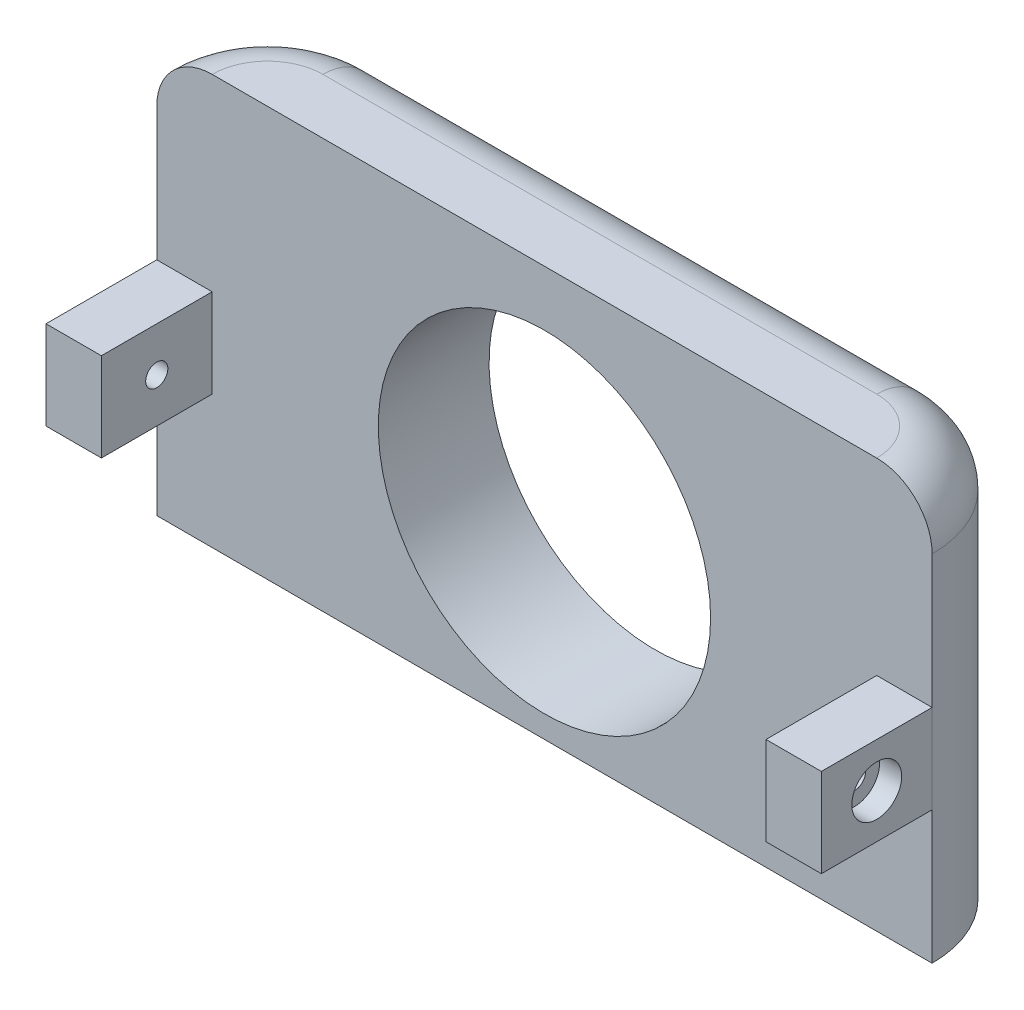
ISO-10303-21;
HEADER;
FILE_DESCRIPTION(('STEP AP214'),'2;1');
FILE_NAME('part.step','',(''),(''),'','','');
FILE_SCHEMA(('AUTOMOTIVE_DESIGN { 1 0 10303 214 1 1 1 1 }'));
ENDSEC;
DATA;
#1=APPLICATION_CONTEXT('core data for automotive mechanical design processes');
#2=APPLICATION_PROTOCOL_DEFINITION('international standard','automotive_design',2000,#1);
#3=PRODUCT_CONTEXT('',#1,'mechanical');
#4=PRODUCT('Part','Part','',(#3));
#5=PRODUCT_RELATED_PRODUCT_CATEGORY('part','',(#4));
#6=PRODUCT_DEFINITION_FORMATION('','',#4);
#7=PRODUCT_DEFINITION_CONTEXT('part definition',#1,'design');
#8=PRODUCT_DEFINITION('design','',#6,#7);
#9=PRODUCT_DEFINITION_SHAPE('','',#8);
#10=(LENGTH_UNIT() NAMED_UNIT(*) SI_UNIT(.MILLI.,.METRE.));
#11=(NAMED_UNIT(*) PLANE_ANGLE_UNIT() SI_UNIT($,.RADIAN.));
#12=(NAMED_UNIT(*) SI_UNIT($,.STERADIAN.) SOLID_ANGLE_UNIT());
#13=UNCERTAINTY_MEASURE_WITH_UNIT(LENGTH_MEASURE(1.E-05),#10,'distance_accuracy_value','');
#14=(GEOMETRIC_REPRESENTATION_CONTEXT(3) GLOBAL_UNCERTAINTY_ASSIGNED_CONTEXT((#13)) GLOBAL_UNIT_ASSIGNED_CONTEXT((#10,
#11,#12)) REPRESENTATION_CONTEXT('',''));
#15=CARTESIAN_POINT('',(0.,0.,0.));
#16=DIRECTION('',(0.,0.,1.));
#17=DIRECTION('',(1.,0.,0.));
#18=AXIS2_PLACEMENT_3D('',#15,#16,#17);
#19=CARTESIAN_POINT('',(-35.,37.,10.));
#20=DIRECTION('',(0.,0.,-1.));
#21=DIRECTION('',(-1.,0.,0.));
#22=AXIS2_PLACEMENT_3D('',#19,#20,#21);
#23=PLANE('',#22);
#24=DIRECTION('',(0.,1.,0.));
#25=VECTOR('',#24,1.);
#26=CARTESIAN_POINT('',(30.,0.,10.));
#27=LINE('',#26,#25);
#28=CARTESIAN_POINT('',(30.,12.,10.));
#29=VERTEX_POINT('',#28);
#30=CARTESIAN_POINT('',(30.,20.,10.));
#31=VERTEX_POINT('',#30);
#32=EDGE_CURVE('E173',#29,#31,#27,.T.);
#33=ORIENTED_EDGE('',*,*,#32,.T.);
#34=DIRECTION('',(1.,0.,0.));
#35=VECTOR('',#34,1.);
#36=CARTESIAN_POINT('',(30.,20.,10.));
#37=LINE('',#36,#35);
#38=CARTESIAN_POINT('',(35.,20.,10.));
#39=VERTEX_POINT('',#38);
#40=EDGE_CURVE('E169',#31,#39,#37,.T.);
#41=ORIENTED_EDGE('',*,*,#40,.T.);
#42=DIRECTION('',(0.,-1.,0.));
#43=VECTOR('',#42,1.);
#44=CARTESIAN_POINT('',(35.,37.,9.99999999999999));
#45=LINE('',#44,#43);
#46=CARTESIAN_POINT('',(35.,32.,9.99999999999999));
#47=VERTEX_POINT('',#46);
#48=EDGE_CURVE('E261',#47,#39,#45,.T.);
#49=ORIENTED_EDGE('',*,*,#48,.F.);
#50=CARTESIAN_POINT('',(30.,32.,9.99999999999999));
#51=DIRECTION('',(0.,0.,-1.));
#52=DIRECTION('',(1.,0.,0.));
#53=AXIS2_PLACEMENT_3D('',#50,#51,#52);
#54=CIRCLE('',#53,5.);
#55=CARTESIAN_POINT('',(30.,37.,9.99999999999999));
#56=VERTEX_POINT('',#55);
#57=EDGE_CURVE('E239',#56,#47,#54,.T.);
#58=ORIENTED_EDGE('',*,*,#57,.F.);
#59=DIRECTION('',(1.,0.,0.));
#60=VECTOR('',#59,1.);
#61=CARTESIAN_POINT('',(-35.,37.,10.));
#62=LINE('',#61,#60);
#63=CARTESIAN_POINT('',(-30.,37.,10.));
#64=VERTEX_POINT('',#63);
#65=EDGE_CURVE('E246',#64,#56,#62,.T.);
#66=ORIENTED_EDGE('',*,*,#65,.F.);
#67=CARTESIAN_POINT('',(-30.,32.,9.99999999999999));
#68=DIRECTION('',(0.,0.,-1.));
#69=DIRECTION('',(-1.,0.,0.));
#70=AXIS2_PLACEMENT_3D('',#67,#68,#69);
#71=CIRCLE('',#70,5.);
#72=CARTESIAN_POINT('',(-35.,32.,9.99999999999999));
#73=VERTEX_POINT('',#72);
#74=EDGE_CURVE('E243',#73,#64,#71,.T.);
#75=ORIENTED_EDGE('',*,*,#74,.F.);
#76=DIRECTION('',(0.,-1.,0.));
#77=VECTOR('',#76,1.);
#78=CARTESIAN_POINT('',(-35.,37.,10.));
#79=LINE('',#78,#77);
#80=CARTESIAN_POINT('',(-35.,20.,10.));
#81=VERTEX_POINT('',#80);
#82=EDGE_CURVE('E265',#73,#81,#79,.T.);
#83=ORIENTED_EDGE('',*,*,#82,.T.);
#84=DIRECTION('',(-1.,0.,0.));
#85=VECTOR('',#84,1.);
#86=CARTESIAN_POINT('',(-30.,20.,10.));
#87=LINE('',#86,#85);
#88=CARTESIAN_POINT('',(-30.,20.,10.));
#89=VERTEX_POINT('',#88);
#90=EDGE_CURVE('E225',#89,#81,#87,.T.);
#91=ORIENTED_EDGE('',*,*,#90,.F.);
#92=DIRECTION('',(0.,1.,0.));
#93=VECTOR('',#92,1.);
#94=CARTESIAN_POINT('',(-30.,0.,10.));
#95=LINE('',#94,#93);
#96=CARTESIAN_POINT('',(-30.,12.,10.));
#97=VERTEX_POINT('',#96);
#98=EDGE_CURVE('E210',#97,#89,#95,.T.);
#99=ORIENTED_EDGE('',*,*,#98,.F.);
#100=DIRECTION('',(-1.,0.,0.));
#101=VECTOR('',#100,1.);
#102=CARTESIAN_POINT('',(-30.,12.,10.));
#103=LINE('',#102,#101);
#104=CARTESIAN_POINT('',(-35.,12.,10.));
#105=VERTEX_POINT('',#104);
#106=EDGE_CURVE('E228',#97,#105,#103,.T.);
#107=ORIENTED_EDGE('',*,*,#106,.T.);
#108=CARTESIAN_POINT('',(-35.,0.,10.));
#109=VERTEX_POINT('',#108);
#110=EDGE_CURVE('E264',#105,#109,#79,.T.);
#111=ORIENTED_EDGE('',*,*,#110,.T.);
#112=DIRECTION('',(1.,0.,0.));
#113=VECTOR('',#112,1.);
#114=CARTESIAN_POINT('',(-35.,0.,10.));
#115=LINE('',#114,#113);
#116=CARTESIAN_POINT('',(35.,0.,9.99999999999999));
#117=VERTEX_POINT('',#116);
#118=EDGE_CURVE('E250',#109,#117,#115,.T.);
#119=ORIENTED_EDGE('',*,*,#118,.T.);
#120=CARTESIAN_POINT('',(35.,12.,9.99999999999999));
#121=VERTEX_POINT('',#120);
#122=EDGE_CURVE('E249',#121,#117,#45,.T.);
#123=ORIENTED_EDGE('',*,*,#122,.F.);
#124=DIRECTION('',(1.,0.,0.));
#125=VECTOR('',#124,1.);
#126=CARTESIAN_POINT('',(30.,12.,10.));
#127=LINE('',#126,#125);
#128=EDGE_CURVE('E188',#29,#121,#127,.T.);
#129=ORIENTED_EDGE('',*,*,#128,.F.);
#130=EDGE_LOOP('',(#33,#41,#49,#58,#66,#75,#83,#91,#99,#107,#111,#119,#123,#129));
#131=FACE_BOUND('',#130,.T.);
#132=CARTESIAN_POINT('',(0.,17.,9.99999999999999));
#133=DIRECTION('',(0.,0.,1.));
#134=DIRECTION('',(1.,0.,0.));
#135=AXIS2_PLACEMENT_3D('',#132,#133,#134);
#136=CIRCLE('',#135,15.);
#137=CARTESIAN_POINT('',(15.,17.,9.99999999999999));
#138=VERTEX_POINT('',#137);
#139=EDGE_CURVE('E233',#138,#138,#136,.T.);
#140=ORIENTED_EDGE('',*,*,#139,.F.);
#141=EDGE_LOOP('',(#140));
#142=FACE_BOUND('',#141,.T.);
#143=ADVANCED_FACE('F42',(#131,#142),#23,.F.);
#144=CARTESIAN_POINT('',(25.,37.,9.99999999999999));
#145=DIRECTION('',(0.,1.,0.));
#146=DIRECTION('',(0.,0.,1.));
#147=AXIS2_PLACEMENT_3D('',#144,#145,#146);
#148=PLANE('',#147);
#149=ORIENTED_EDGE('',*,*,#65,.T.);
#150=CARTESIAN_POINT('',(25.,37.,9.99999999999999));
#151=DIRECTION('',(0.,1.,0.));
#152=DIRECTION('',(0.,0.,1.));
#153=AXIS2_PLACEMENT_3D('',#150,#151,#152);
#154=CIRCLE('',#153,5.);
#155=CARTESIAN_POINT('',(25.,37.,4.99999999999999));
#156=VERTEX_POINT('',#155);
#157=EDGE_CURVE('E276',#56,#156,#154,.T.);
#158=ORIENTED_EDGE('',*,*,#157,.T.);
#159=DIRECTION('',(-1.,0.,0.));
#160=VECTOR('',#159,1.);
#161=CARTESIAN_POINT('',(-25.,37.,5.));
#162=LINE('',#161,#160);
#163=CARTESIAN_POINT('',(-25.,37.,5.));
#164=VERTEX_POINT('',#163);
#165=EDGE_CURVE('E272',#156,#164,#162,.T.);
#166=ORIENTED_EDGE('',*,*,#165,.T.);
#167=CARTESIAN_POINT('',(-25.,37.,10.));
#168=DIRECTION('',(0.,1.,0.));
#169=DIRECTION('',(0.,0.,1.));
#170=AXIS2_PLACEMENT_3D('',#167,#168,#169);
#171=CIRCLE('',#170,5.);
#172=EDGE_CURVE('E274',#164,#64,#171,.T.);
#173=ORIENTED_EDGE('',*,*,#172,.T.);
#174=EDGE_LOOP('',(#149,#158,#166,#173));
#175=FACE_BOUND('',#174,.T.);
#176=ADVANCED_FACE('F297',(#175),#148,.T.);
#177=CARTESIAN_POINT('',(25.,37.,9.99999999999999));
#178=DIRECTION('',(0.,-1.,0.));
#179=DIRECTION('',(0.,0.,-1.));
#180=AXIS2_PLACEMENT_3D('',#177,#178,#179);
#181=CYLINDRICAL_SURFACE('',#180,10.);
#182=DIRECTION('',(0.,-1.,0.));
#183=VECTOR('',#182,1.);
#184=CARTESIAN_POINT('',(25.,37.,0.));
#185=LINE('',#184,#183);
#186=CARTESIAN_POINT('',(25.,32.,0.));
#187=VERTEX_POINT('',#186);
#188=CARTESIAN_POINT('',(25.,0.,0.));
#189=VERTEX_POINT('',#188);
#190=EDGE_CURVE('E270',#187,#189,#185,.T.);
#191=ORIENTED_EDGE('',*,*,#190,.F.);
#192=CARTESIAN_POINT('',(25.,32.,9.99999999999999));
#193=DIRECTION('',(0.,1.,0.));
#194=DIRECTION('',(0.,0.,1.));
#195=AXIS2_PLACEMENT_3D('',#192,#193,#194);
#196=CIRCLE('',#195,10.);
#197=EDGE_CURVE('E278',#187,#47,#196,.F.);
#198=ORIENTED_EDGE('',*,*,#197,.T.);
#199=ORIENTED_EDGE('',*,*,#48,.T.);
#200=DIRECTION('',(0.,1.,0.));
#201=VECTOR('',#200,1.);
#202=CARTESIAN_POINT('',(35.,0.,10.));
#203=LINE('',#202,#201);
#204=EDGE_CURVE('E184',#121,#39,#203,.T.);
#205=ORIENTED_EDGE('',*,*,#204,.F.);
#206=ORIENTED_EDGE('',*,*,#122,.T.);
#207=CARTESIAN_POINT('',(25.,0.,9.99999999999999));
#208=DIRECTION('',(0.,1.,0.));
#209=DIRECTION('',(0.,0.,1.));
#210=AXIS2_PLACEMENT_3D('',#207,#208,#209);
#211=CIRCLE('',#210,10.);
#212=EDGE_CURVE('E242',#117,#189,#211,.T.);
#213=ORIENTED_EDGE('',*,*,#212,.T.);
#214=EDGE_LOOP('',(#191,#198,#199,#205,#206,#213));
#215=FACE_BOUND('',#214,.T.);
#216=ADVANCED_FACE('F306',(#215),#181,.T.);
#217=CARTESIAN_POINT('',(-25.,37.,0.));
#218=DIRECTION('',(0.,0.,1.));
#219=DIRECTION('',(1.,0.,0.));
#220=AXIS2_PLACEMENT_3D('',#217,#218,#219);
#221=PLANE('',#220);
#222=DIRECTION('',(-1.,0.,0.));
#223=VECTOR('',#222,1.);
#224=CARTESIAN_POINT('',(25.,32.,0.));
#225=LINE('',#224,#223);
#226=CARTESIAN_POINT('',(-25.,32.,0.));
#227=VERTEX_POINT('',#226);
#228=CARTESIAN_POINT('',(0.,32.,0.));
#229=VERTEX_POINT('',#228);
#230=EDGE_CURVE('E11',#227,#229,#225,.F.);
#231=ORIENTED_EDGE('',*,*,#230,.T.);
#232=CARTESIAN_POINT('',(0.,17.,0.));
#233=DIRECTION('',(0.,0.,1.));
#234=DIRECTION('',(1.,0.,0.));
#235=AXIS2_PLACEMENT_3D('',#232,#233,#234);
#236=CIRCLE('',#235,15.);
#237=EDGE_CURVE('E236',#229,#229,#236,.F.);
#238=ORIENTED_EDGE('',*,*,#237,.F.);
#239=EDGE_CURVE('E51',#229,#187,#225,.F.);
#240=ORIENTED_EDGE('',*,*,#239,.T.);
#241=ORIENTED_EDGE('',*,*,#190,.T.);
#242=DIRECTION('',(-1.,0.,0.));
#243=VECTOR('',#242,1.);
#244=CARTESIAN_POINT('',(-25.,0.,0.));
#245=LINE('',#244,#243);
#246=CARTESIAN_POINT('',(-25.,0.,0.));
#247=VERTEX_POINT('',#246);
#248=EDGE_CURVE('E253',#189,#247,#245,.T.);
#249=ORIENTED_EDGE('',*,*,#248,.T.);
#250=DIRECTION('',(0.,-1.,0.));
#251=VECTOR('',#250,1.);
#252=CARTESIAN_POINT('',(-25.,37.,0.));
#253=LINE('',#252,#251);
#254=EDGE_CURVE('E268',#227,#247,#253,.T.);
#255=ORIENTED_EDGE('',*,*,#254,.F.);
#256=EDGE_LOOP('',(#231,#238,#240,#241,#249,#255));
#257=FACE_BOUND('',#256,.T.);
#258=ADVANCED_FACE('F313',(#257),#221,.F.);
#259=CARTESIAN_POINT('',(-25.,37.,10.));
#260=DIRECTION('',(0.,-1.,0.));
#261=DIRECTION('',(0.,0.,-1.));
#262=AXIS2_PLACEMENT_3D('',#259,#260,#261);
#263=CYLINDRICAL_SURFACE('',#262,10.);
#264=ORIENTED_EDGE('',*,*,#82,.F.);
#265=CARTESIAN_POINT('',(-25.,32.,10.));
#266=DIRECTION('',(0.,1.,0.));
#267=DIRECTION('',(0.,0.,1.));
#268=AXIS2_PLACEMENT_3D('',#265,#266,#267);
#269=CIRCLE('',#268,10.);
#270=EDGE_CURVE('E280',#73,#227,#269,.F.);
#271=ORIENTED_EDGE('',*,*,#270,.T.);
#272=ORIENTED_EDGE('',*,*,#254,.T.);
#273=CARTESIAN_POINT('',(-25.,0.,10.));
#274=DIRECTION('',(0.,1.,0.));
#275=DIRECTION('',(0.,0.,-1.));
#276=AXIS2_PLACEMENT_3D('',#273,#274,#275);
#277=CIRCLE('',#276,10.);
#278=EDGE_CURVE('E256',#247,#109,#277,.T.);
#279=ORIENTED_EDGE('',*,*,#278,.T.);
#280=ORIENTED_EDGE('',*,*,#110,.F.);
#281=DIRECTION('',(0.,1.,0.));
#282=VECTOR('',#281,1.);
#283=CARTESIAN_POINT('',(-35.,0.,10.));
#284=LINE('',#283,#282);
#285=EDGE_CURVE('E219',#105,#81,#284,.T.);
#286=ORIENTED_EDGE('',*,*,#285,.T.);
#287=EDGE_LOOP('',(#264,#271,#272,#279,#280,#286));
#288=FACE_BOUND('',#287,.T.);
#289=ADVANCED_FACE('F316',(#288),#263,.T.);
#290=CARTESIAN_POINT('',(25.,0.,9.99999999999999));
#291=DIRECTION('',(0.,1.,0.));
#292=DIRECTION('',(0.,0.,1.));
#293=AXIS2_PLACEMENT_3D('',#290,#291,#292);
#294=PLANE('',#293);
#295=ORIENTED_EDGE('',*,*,#212,.F.);
#296=ORIENTED_EDGE('',*,*,#118,.F.);
#297=ORIENTED_EDGE('',*,*,#278,.F.);
#298=ORIENTED_EDGE('',*,*,#248,.F.);
#299=EDGE_LOOP('',(#295,#296,#297,#298));
#300=FACE_BOUND('',#299,.T.);
#301=ADVANCED_FACE('F333',(#300),#294,.F.);
#302=CARTESIAN_POINT('',(-25.,32.,10.));
#303=DIRECTION('',(0.,1.,0.));
#304=DIRECTION('',(0.,0.,1.));
#305=AXIS2_PLACEMENT_3D('',#302,#303,#304);
#306=TOROIDAL_SURFACE('',#305,5.,5.);
#307=ORIENTED_EDGE('',*,*,#74,.T.);
#308=ORIENTED_EDGE('',*,*,#172,.F.);
#309=CARTESIAN_POINT('',(-25.,32.,5.));
#310=DIRECTION('',(1.,0.,0.));
#311=DIRECTION('',(0.,0.,-1.));
#312=AXIS2_PLACEMENT_3D('',#309,#310,#311);
#313=CIRCLE('',#312,5.);
#314=EDGE_CURVE('E46',#227,#164,#313,.T.);
#315=ORIENTED_EDGE('',*,*,#314,.F.);
#316=ORIENTED_EDGE('',*,*,#270,.F.);
#317=EDGE_LOOP('',(#307,#308,#315,#316));
#318=FACE_BOUND('',#317,.T.);
#319=ADVANCED_FACE('F44',(#318),#306,.T.);
#320=CARTESIAN_POINT('',(25.,32.,4.99999999999999));
#321=DIRECTION('',(1.,0.,0.));
#322=DIRECTION('',(0.,0.,-1.));
#323=AXIS2_PLACEMENT_3D('',#320,#321,#322);
#324=CYLINDRICAL_SURFACE('',#323,5.);
#325=ORIENTED_EDGE('',*,*,#314,.T.);
#326=ORIENTED_EDGE('',*,*,#165,.F.);
#327=CARTESIAN_POINT('',(25.,32.,4.99999999999999));
#328=DIRECTION('',(1.,0.,0.));
#329=DIRECTION('',(0.,1.,0.));
#330=AXIS2_PLACEMENT_3D('',#327,#328,#329);
#331=CIRCLE('',#330,5.);
#332=EDGE_CURVE('E238',#187,#156,#331,.T.);
#333=ORIENTED_EDGE('',*,*,#332,.F.);
#334=ORIENTED_EDGE('',*,*,#239,.F.);
#335=ORIENTED_EDGE('',*,*,#230,.F.);
#336=EDGE_LOOP('',(#325,#326,#333,#334,#335));
#337=FACE_BOUND('',#336,.T.);
#338=ADVANCED_FACE('F290',(#337),#324,.T.);
#339=CARTESIAN_POINT('',(25.,32.,9.99999999999999));
#340=DIRECTION('',(0.,1.,0.));
#341=DIRECTION('',(0.,0.,1.));
#342=AXIS2_PLACEMENT_3D('',#339,#340,#341);
#343=DEGENERATE_TOROIDAL_SURFACE('',#342,5.,5.,.T.);
#344=ORIENTED_EDGE('',*,*,#332,.T.);
#345=ORIENTED_EDGE('',*,*,#157,.F.);
#346=ORIENTED_EDGE('',*,*,#57,.T.);
#347=ORIENTED_EDGE('',*,*,#197,.F.);
#348=EDGE_LOOP('',(#344,#345,#346,#347));
#349=FACE_BOUND('',#348,.T.);
#350=ADVANCED_FACE('F303',(#349),#343,.T.);
#351=CARTESIAN_POINT('',(0.,17.,-0.00100000000000794));
#352=DIRECTION('',(0.,0.,1.));
#353=DIRECTION('',(1.,0.,0.));
#354=AXIS2_PLACEMENT_3D('',#351,#352,#353);
#355=CYLINDRICAL_SURFACE('',#354,15.);
#356=ORIENTED_EDGE('',*,*,#139,.T.);
#357=EDGE_LOOP('',(#356));
#358=FACE_BOUND('',#357,.T.);
#359=ORIENTED_EDGE('',*,*,#237,.T.);
#360=EDGE_LOOP('',(#359));
#361=FACE_BOUND('',#360,.T.);
#362=ADVANCED_FACE('F353',(#358,#361),#355,.F.);
#363=CARTESIAN_POINT('',(-30.,0.,20.));
#364=DIRECTION('',(0.,0.,1.));
#365=DIRECTION('',(1.,0.,0.));
#366=AXIS2_PLACEMENT_3D('',#363,#364,#365);
#367=PLANE('',#366);
#368=DIRECTION('',(0.,1.,0.));
#369=VECTOR('',#368,1.);
#370=CARTESIAN_POINT('',(-35.,0.,20.));
#371=LINE('',#370,#369);
#372=CARTESIAN_POINT('',(-35.,12.,20.));
#373=VERTEX_POINT('',#372);
#374=CARTESIAN_POINT('',(-35.,20.,20.));
#375=VERTEX_POINT('',#374);
#376=EDGE_CURVE('E197',#373,#375,#371,.T.);
#377=ORIENTED_EDGE('',*,*,#376,.F.);
#378=DIRECTION('',(-1.,0.,0.));
#379=VECTOR('',#378,1.);
#380=CARTESIAN_POINT('',(-30.,12.,20.));
#381=LINE('',#380,#379);
#382=CARTESIAN_POINT('',(-30.,12.,20.));
#383=VERTEX_POINT('',#382);
#384=EDGE_CURVE('E231',#383,#373,#381,.T.);
#385=ORIENTED_EDGE('',*,*,#384,.F.);
#386=DIRECTION('',(0.,1.,0.));
#387=VECTOR('',#386,1.);
#388=CARTESIAN_POINT('',(-30.,0.,20.));
#389=LINE('',#388,#387);
#390=CARTESIAN_POINT('',(-30.,20.,20.));
#391=VERTEX_POINT('',#390);
#392=EDGE_CURVE('E203',#383,#391,#389,.T.);
#393=ORIENTED_EDGE('',*,*,#392,.T.);
#394=DIRECTION('',(-1.,0.,0.));
#395=VECTOR('',#394,1.);
#396=CARTESIAN_POINT('',(-30.,20.,20.));
#397=LINE('',#396,#395);
#398=EDGE_CURVE('E215',#391,#375,#397,.T.);
#399=ORIENTED_EDGE('',*,*,#398,.T.);
#400=EDGE_LOOP('',(#377,#385,#393,#399));
#401=FACE_BOUND('',#400,.T.);
#402=ADVANCED_FACE('F370',(#401),#367,.T.);
#403=CARTESIAN_POINT('',(-30.,12.,0.));
#404=DIRECTION('',(0.,-1.,0.));
#405=DIRECTION('',(0.,0.,-1.));
#406=AXIS2_PLACEMENT_3D('',#403,#404,#405);
#407=PLANE('',#406);
#408=DIRECTION('',(0.,0.,1.));
#409=VECTOR('',#408,1.);
#410=CARTESIAN_POINT('',(-35.,12.,0.));
#411=LINE('',#410,#409);
#412=EDGE_CURVE('E67',#105,#373,#411,.T.);
#413=ORIENTED_EDGE('',*,*,#412,.F.);
#414=ORIENTED_EDGE('',*,*,#106,.F.);
#415=DIRECTION('',(0.,0.,1.));
#416=VECTOR('',#415,1.);
#417=CARTESIAN_POINT('',(-30.,12.,0.));
#418=LINE('',#417,#416);
#419=EDGE_CURVE('E207',#97,#383,#418,.T.);
#420=ORIENTED_EDGE('',*,*,#419,.T.);
#421=ORIENTED_EDGE('',*,*,#384,.T.);
#422=EDGE_LOOP('',(#413,#414,#420,#421));
#423=FACE_BOUND('',#422,.T.);
#424=ADVANCED_FACE('F328',(#423),#407,.T.);
#425=CARTESIAN_POINT('',(-30.,16.,15.));
#426=DIRECTION('',(-1.,0.,0.));
#427=DIRECTION('',(0.,0.,1.));
#428=AXIS2_PLACEMENT_3D('',#425,#426,#427);
#429=CYLINDRICAL_SURFACE('',#428,1.);
#430=CARTESIAN_POINT('',(-33.,16.,15.));
#431=DIRECTION('',(1.,0.,0.));
#432=DIRECTION('',(0.,0.,-1.));
#433=AXIS2_PLACEMENT_3D('',#430,#431,#432);
#434=CIRCLE('',#433,1.);
#435=CARTESIAN_POINT('',(-33.,16.,14.));
#436=VERTEX_POINT('',#435);
#437=EDGE_CURVE('E191',#436,#436,#434,.T.);
#438=ORIENTED_EDGE('',*,*,#437,.F.);
#439=EDGE_LOOP('',(#438));
#440=FACE_BOUND('',#439,.T.);
#441=CARTESIAN_POINT('',(-30.,16.,15.));
#442=DIRECTION('',(1.,0.,0.));
#443=DIRECTION('',(0.,0.,-1.));
#444=AXIS2_PLACEMENT_3D('',#441,#442,#443);
#445=CIRCLE('',#444,1.);
#446=CARTESIAN_POINT('',(-30.,16.,14.));
#447=VERTEX_POINT('',#446);
#448=EDGE_CURVE('E200',#447,#447,#445,.T.);
#449=ORIENTED_EDGE('',*,*,#448,.T.);
#450=EDGE_LOOP('',(#449));
#451=FACE_BOUND('',#450,.T.);
#452=ADVANCED_FACE('F386',(#440,#451),#429,.F.);
#453=CARTESIAN_POINT('',(-30.,20.,0.));
#454=DIRECTION('',(0.,-1.,0.));
#455=DIRECTION('',(0.,0.,-1.));
#456=AXIS2_PLACEMENT_3D('',#453,#454,#455);
#457=PLANE('',#456);
#458=DIRECTION('',(0.,0.,1.));
#459=VECTOR('',#458,1.);
#460=CARTESIAN_POINT('',(-35.,20.,0.));
#461=LINE('',#460,#459);
#462=EDGE_CURVE('E204',#81,#375,#461,.T.);
#463=ORIENTED_EDGE('',*,*,#462,.T.);
#464=ORIENTED_EDGE('',*,*,#398,.F.);
#465=DIRECTION('',(0.,0.,1.));
#466=VECTOR('',#465,1.);
#467=CARTESIAN_POINT('',(-30.,20.,0.));
#468=LINE('',#467,#466);
#469=EDGE_CURVE('E213',#89,#391,#468,.T.);
#470=ORIENTED_EDGE('',*,*,#469,.F.);
#471=ORIENTED_EDGE('',*,*,#90,.T.);
#472=EDGE_LOOP('',(#463,#464,#470,#471));
#473=FACE_BOUND('',#472,.T.);
#474=ADVANCED_FACE('F322',(#473),#457,.F.);
#475=CARTESIAN_POINT('',(-30.,0.,0.));
#476=DIRECTION('',(1.,0.,0.));
#477=DIRECTION('',(0.,0.,-1.));
#478=AXIS2_PLACEMENT_3D('',#475,#476,#477);
#479=PLANE('',#478);
#480=ORIENTED_EDGE('',*,*,#448,.F.);
#481=EDGE_LOOP('',(#480));
#482=FACE_BOUND('',#481,.T.);
#483=ORIENTED_EDGE('',*,*,#392,.F.);
#484=ORIENTED_EDGE('',*,*,#419,.F.);
#485=ORIENTED_EDGE('',*,*,#98,.T.);
#486=ORIENTED_EDGE('',*,*,#469,.T.);
#487=EDGE_LOOP('',(#483,#484,#485,#486));
#488=FACE_BOUND('',#487,.T.);
#489=ADVANCED_FACE('F327',(#482,#488),#479,.T.);
#490=CARTESIAN_POINT('',(-35.,0.,0.));
#491=DIRECTION('',(1.,0.,0.));
#492=DIRECTION('',(0.,0.,-1.));
#493=AXIS2_PLACEMENT_3D('',#490,#491,#492);
#494=PLANE('',#493);
#495=CARTESIAN_POINT('',(-35.,16.,15.));
#496=DIRECTION('',(1.,0.,0.));
#497=DIRECTION('',(0.,0.,-1.));
#498=AXIS2_PLACEMENT_3D('',#495,#496,#497);
#499=CIRCLE('',#498,2.25);
#500=CARTESIAN_POINT('',(-35.,16.,12.75));
#501=VERTEX_POINT('',#500);
#502=EDGE_CURVE('E168',#501,#501,#499,.T.);
#503=ORIENTED_EDGE('',*,*,#502,.T.);
#504=EDGE_LOOP('',(#503));
#505=FACE_BOUND('',#504,.T.);
#506=ORIENTED_EDGE('',*,*,#376,.T.);
#507=ORIENTED_EDGE('',*,*,#462,.F.);
#508=ORIENTED_EDGE('',*,*,#285,.F.);
#509=ORIENTED_EDGE('',*,*,#412,.T.);
#510=EDGE_LOOP('',(#506,#507,#508,#509));
#511=FACE_BOUND('',#510,.T.);
#512=ADVANCED_FACE('F407',(#505,#511),#494,.F.);
#513=CARTESIAN_POINT('',(-33.,16.,15.));
#514=DIRECTION('',(-1.,0.,0.));
#515=DIRECTION('',(0.,0.,1.));
#516=AXIS2_PLACEMENT_3D('',#513,#514,#515);
#517=CYLINDRICAL_SURFACE('',#516,2.25);
#518=CARTESIAN_POINT('',(-33.,16.,15.));
#519=DIRECTION('',(1.,0.,0.));
#520=DIRECTION('',(0.,0.,-1.));
#521=AXIS2_PLACEMENT_3D('',#518,#519,#520);
#522=CIRCLE('',#521,2.25);
#523=CARTESIAN_POINT('',(-33.,16.,12.75));
#524=VERTEX_POINT('',#523);
#525=EDGE_CURVE('E194',#524,#524,#522,.T.);
#526=ORIENTED_EDGE('',*,*,#525,.T.);
#527=EDGE_LOOP('',(#526));
#528=FACE_BOUND('',#527,.T.);
#529=ORIENTED_EDGE('',*,*,#502,.F.);
#530=EDGE_LOOP('',(#529));
#531=FACE_BOUND('',#530,.T.);
#532=ADVANCED_FACE('F414',(#528,#531),#517,.F.);
#533=CARTESIAN_POINT('',(-33.,0.,0.));
#534=DIRECTION('',(1.,0.,0.));
#535=DIRECTION('',(0.,0.,-1.));
#536=AXIS2_PLACEMENT_3D('',#533,#534,#535);
#537=PLANE('',#536);
#538=ORIENTED_EDGE('',*,*,#437,.T.);
#539=EDGE_LOOP('',(#538));
#540=FACE_BOUND('',#539,.T.);
#541=ORIENTED_EDGE('',*,*,#525,.F.);
#542=EDGE_LOOP('',(#541));
#543=FACE_BOUND('',#542,.T.);
#544=ADVANCED_FACE('F422',(#540,#543),#537,.F.);
#545=CARTESIAN_POINT('',(30.,0.,20.));
#546=DIRECTION('',(0.,0.,-1.));
#547=DIRECTION('',(-1.,0.,0.));
#548=AXIS2_PLACEMENT_3D('',#545,#546,#547);
#549=PLANE('',#548);
#550=DIRECTION('',(0.,1.,0.));
#551=VECTOR('',#550,1.);
#552=CARTESIAN_POINT('',(35.,0.,20.));
#553=LINE('',#552,#551);
#554=CARTESIAN_POINT('',(35.,12.,20.));
#555=VERTEX_POINT('',#554);
#556=CARTESIAN_POINT('',(35.,20.,20.));
#557=VERTEX_POINT('',#556);
#558=EDGE_CURVE('E165',#555,#557,#553,.T.);
#559=ORIENTED_EDGE('',*,*,#558,.T.);
#560=DIRECTION('',(1.,0.,0.));
#561=VECTOR('',#560,1.);
#562=CARTESIAN_POINT('',(30.,20.,20.));
#563=LINE('',#562,#561);
#564=CARTESIAN_POINT('',(30.,20.,20.));
#565=VERTEX_POINT('',#564);
#566=EDGE_CURVE('E163',#565,#557,#563,.T.);
#567=ORIENTED_EDGE('',*,*,#566,.F.);
#568=DIRECTION('',(0.,1.,0.));
#569=VECTOR('',#568,1.);
#570=CARTESIAN_POINT('',(30.,0.,20.));
#571=LINE('',#570,#569);
#572=CARTESIAN_POINT('',(30.,12.,20.));
#573=VERTEX_POINT('',#572);
#574=EDGE_CURVE('E149',#573,#565,#571,.T.);
#575=ORIENTED_EDGE('',*,*,#574,.F.);
#576=DIRECTION('',(1.,0.,0.));
#577=VECTOR('',#576,1.);
#578=CARTESIAN_POINT('',(30.,12.,20.));
#579=LINE('',#578,#577);
#580=EDGE_CURVE('E179',#573,#555,#579,.T.);
#581=ORIENTED_EDGE('',*,*,#580,.T.);
#582=EDGE_LOOP('',(#559,#567,#575,#581));
#583=FACE_BOUND('',#582,.T.);
#584=ADVANCED_FACE('F164',(#583),#549,.F.);
#585=CARTESIAN_POINT('',(30.,20.,0.));
#586=DIRECTION('',(0.,1.,0.));
#587=DIRECTION('',(0.,0.,1.));
#588=AXIS2_PLACEMENT_3D('',#585,#586,#587);
#589=PLANE('',#588);
#590=DIRECTION('',(0.,0.,1.));
#591=VECTOR('',#590,1.);
#592=CARTESIAN_POINT('',(35.,20.,0.));
#593=LINE('',#592,#591);
#594=EDGE_CURVE('E181',#39,#557,#593,.T.);
#595=ORIENTED_EDGE('',*,*,#594,.F.);
#596=ORIENTED_EDGE('',*,*,#40,.F.);
#597=DIRECTION('',(0.,0.,1.));
#598=VECTOR('',#597,1.);
#599=CARTESIAN_POINT('',(30.,20.,0.));
#600=LINE('',#599,#598);
#601=EDGE_CURVE('E154',#31,#565,#600,.T.);
#602=ORIENTED_EDGE('',*,*,#601,.T.);
#603=ORIENTED_EDGE('',*,*,#566,.T.);
#604=EDGE_LOOP('',(#595,#596,#602,#603));
#605=FACE_BOUND('',#604,.T.);
#606=ADVANCED_FACE('F171',(#605),#589,.T.);
#607=CARTESIAN_POINT('',(30.,16.,15.));
#608=DIRECTION('',(1.,0.,0.));
#609=DIRECTION('',(0.,0.,-1.));
#610=AXIS2_PLACEMENT_3D('',#607,#608,#609);
#611=CYLINDRICAL_SURFACE('',#610,1.);
#612=CARTESIAN_POINT('',(33.,16.,15.));
#613=DIRECTION('',(1.,0.,0.));
#614=DIRECTION('',(0.,0.,-1.));
#615=AXIS2_PLACEMENT_3D('',#612,#613,#614);
#616=CIRCLE('',#615,1.);
#617=CARTESIAN_POINT('',(33.,16.,14.));
#618=VERTEX_POINT('',#617);
#619=EDGE_CURVE('E631',#618,#618,#616,.T.);
#620=ORIENTED_EDGE('',*,*,#619,.T.);
#621=EDGE_LOOP('',(#620));
#622=FACE_BOUND('',#621,.T.);
#623=CARTESIAN_POINT('',(30.,16.,15.));
#624=DIRECTION('',(1.,0.,0.));
#625=DIRECTION('',(0.,0.,-1.));
#626=AXIS2_PLACEMENT_3D('',#623,#624,#625);
#627=CIRCLE('',#626,1.);
#628=CARTESIAN_POINT('',(30.,16.,14.));
#629=VERTEX_POINT('',#628);
#630=EDGE_CURVE('E160',#629,#629,#627,.T.);
#631=ORIENTED_EDGE('',*,*,#630,.F.);
#632=EDGE_LOOP('',(#631));
#633=FACE_BOUND('',#632,.T.);
#634=ADVANCED_FACE('F444',(#622,#633),#611,.F.);
#635=CARTESIAN_POINT('',(30.,12.,0.));
#636=DIRECTION('',(0.,1.,0.));
#637=DIRECTION('',(0.,0.,1.));
#638=AXIS2_PLACEMENT_3D('',#635,#636,#637);
#639=PLANE('',#638);
#640=DIRECTION('',(0.,0.,1.));
#641=VECTOR('',#640,1.);
#642=CARTESIAN_POINT('',(35.,12.,0.));
#643=LINE('',#642,#641);
#644=EDGE_CURVE('E59',#121,#555,#643,.T.);
#645=ORIENTED_EDGE('',*,*,#644,.T.);
#646=ORIENTED_EDGE('',*,*,#580,.F.);
#647=DIRECTION('',(0.,0.,1.));
#648=VECTOR('',#647,1.);
#649=CARTESIAN_POINT('',(30.,12.,0.));
#650=LINE('',#649,#648);
#651=EDGE_CURVE('E156',#29,#573,#650,.T.);
#652=ORIENTED_EDGE('',*,*,#651,.F.);
#653=ORIENTED_EDGE('',*,*,#128,.T.);
#654=EDGE_LOOP('',(#645,#646,#652,#653));
#655=FACE_BOUND('',#654,.T.);
#656=ADVANCED_FACE('F451',(#655),#639,.F.);
#657=CARTESIAN_POINT('',(30.,0.,0.));
#658=DIRECTION('',(-1.,0.,0.));
#659=DIRECTION('',(0.,0.,-1.));
#660=AXIS2_PLACEMENT_3D('',#657,#658,#659);
#661=PLANE('',#660);
#662=ORIENTED_EDGE('',*,*,#630,.T.);
#663=EDGE_LOOP('',(#662));
#664=FACE_BOUND('',#663,.T.);
#665=ORIENTED_EDGE('',*,*,#574,.T.);
#666=ORIENTED_EDGE('',*,*,#601,.F.);
#667=ORIENTED_EDGE('',*,*,#32,.F.);
#668=ORIENTED_EDGE('',*,*,#651,.T.);
#669=EDGE_LOOP('',(#665,#666,#667,#668));
#670=FACE_BOUND('',#669,.T.);
#671=ADVANCED_FACE('F151',(#664,#670),#661,.T.);
#672=CARTESIAN_POINT('',(35.,0.,0.));
#673=DIRECTION('',(-1.,0.,0.));
#674=DIRECTION('',(0.,0.,-1.));
#675=AXIS2_PLACEMENT_3D('',#672,#673,#674);
#676=PLANE('',#675);
#677=CARTESIAN_POINT('',(35.,16.,15.));
#678=DIRECTION('',(1.,0.,0.));
#679=DIRECTION('',(0.,0.,-1.));
#680=AXIS2_PLACEMENT_3D('',#677,#678,#679);
#681=CIRCLE('',#680,2.25);
#682=CARTESIAN_POINT('',(35.,16.,12.75));
#683=VERTEX_POINT('',#682);
#684=EDGE_CURVE('E635',#683,#683,#681,.T.);
#685=ORIENTED_EDGE('',*,*,#684,.F.);
#686=EDGE_LOOP('',(#685));
#687=FACE_BOUND('',#686,.T.);
#688=ORIENTED_EDGE('',*,*,#558,.F.);
#689=ORIENTED_EDGE('',*,*,#644,.F.);
#690=ORIENTED_EDGE('',*,*,#204,.T.);
#691=ORIENTED_EDGE('',*,*,#594,.T.);
#692=EDGE_LOOP('',(#688,#689,#690,#691));
#693=FACE_BOUND('',#692,.T.);
#694=ADVANCED_FACE('F466',(#687,#693),#676,.F.);
#695=CARTESIAN_POINT('',(33.,16.,15.));
#696=DIRECTION('',(1.,0.,0.));
#697=DIRECTION('',(0.,0.,-1.));
#698=AXIS2_PLACEMENT_3D('',#695,#696,#697);
#699=CYLINDRICAL_SURFACE('',#698,2.25);
#700=CARTESIAN_POINT('',(33.,16.,15.));
#701=DIRECTION('',(1.,0.,0.));
#702=DIRECTION('',(0.,0.,-1.));
#703=AXIS2_PLACEMENT_3D('',#700,#701,#702);
#704=CIRCLE('',#703,2.25);
#705=CARTESIAN_POINT('',(33.,16.,12.75));
#706=VERTEX_POINT('',#705);
#707=EDGE_CURVE('E182',#706,#706,#704,.T.);
#708=ORIENTED_EDGE('',*,*,#707,.F.);
#709=EDGE_LOOP('',(#708));
#710=FACE_BOUND('',#709,.T.);
#711=ORIENTED_EDGE('',*,*,#684,.T.);
#712=EDGE_LOOP('',(#711));
#713=FACE_BOUND('',#712,.T.);
#714=ADVANCED_FACE('F474',(#710,#713),#699,.F.);
#715=CARTESIAN_POINT('',(33.,0.,0.));
#716=DIRECTION('',(-1.,0.,0.));
#717=DIRECTION('',(0.,0.,-1.));
#718=AXIS2_PLACEMENT_3D('',#715,#716,#717);
#719=PLANE('',#718);
#720=ORIENTED_EDGE('',*,*,#619,.F.);
#721=EDGE_LOOP('',(#720));
#722=FACE_BOUND('',#721,.T.);
#723=ORIENTED_EDGE('',*,*,#707,.T.);
#724=EDGE_LOOP('',(#723));
#725=FACE_BOUND('',#724,.T.);
#726=ADVANCED_FACE('F482',(#722,#725),#719,.F.);
#727=CLOSED_SHELL('',(#143,#176,#216,#258,#289,#301,#319,#338,#350,#362,#402,#424,#452,#474,
#489,#512,#532,#544,#584,#606,#634,#656,#671,#694,#714,#726));
#728=MANIFOLD_SOLID_BREP('B2',#727);
#729=ADVANCED_BREP_SHAPE_REPRESENTATION('',(#18,#728),#14);
#730=SHAPE_DEFINITION_REPRESENTATION(#9,#729);
ENDSEC;
END-ISO-10303-21;
